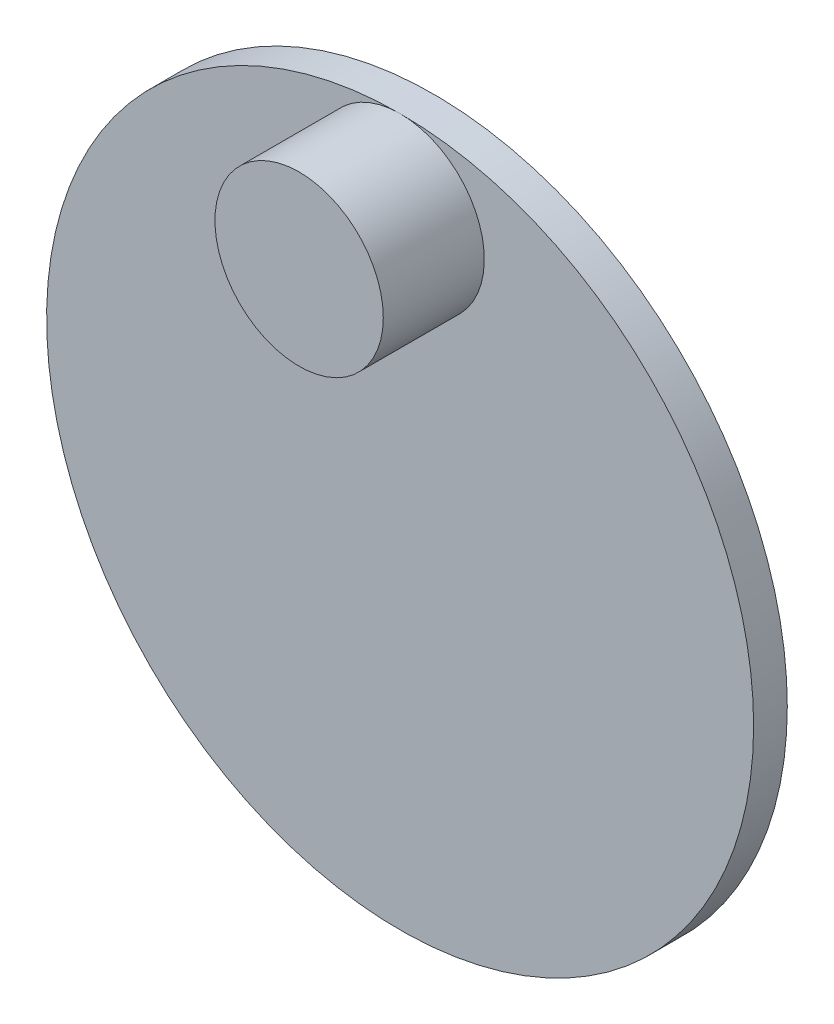
ISO-10303-21;
HEADER;
FILE_DESCRIPTION(('STEP AP214'),'2;1');
FILE_NAME('part.step','',(''),(''),'','','');
FILE_SCHEMA(('AUTOMOTIVE_DESIGN { 1 0 10303 214 1 1 1 1 }'));
ENDSEC;
DATA;
#1=APPLICATION_CONTEXT('core data for automotive mechanical design processes');
#2=APPLICATION_PROTOCOL_DEFINITION('international standard','automotive_design',2000,#1);
#3=PRODUCT_CONTEXT('',#1,'mechanical');
#4=PRODUCT('Part','Part','',(#3));
#5=PRODUCT_RELATED_PRODUCT_CATEGORY('part','',(#4));
#6=PRODUCT_DEFINITION_FORMATION('','',#4);
#7=PRODUCT_DEFINITION_CONTEXT('part definition',#1,'design');
#8=PRODUCT_DEFINITION('design','',#6,#7);
#9=PRODUCT_DEFINITION_SHAPE('','',#8);
#10=(LENGTH_UNIT() NAMED_UNIT(*) SI_UNIT(.MILLI.,.METRE.));
#11=(NAMED_UNIT(*) PLANE_ANGLE_UNIT() SI_UNIT($,.RADIAN.));
#12=(NAMED_UNIT(*) SI_UNIT($,.STERADIAN.) SOLID_ANGLE_UNIT());
#13=UNCERTAINTY_MEASURE_WITH_UNIT(LENGTH_MEASURE(1.E-05),#10,'distance_accuracy_value','');
#14=(GEOMETRIC_REPRESENTATION_CONTEXT(3) GLOBAL_UNCERTAINTY_ASSIGNED_CONTEXT((#13)) GLOBAL_UNIT_ASSIGNED_CONTEXT((#10,
#11,#12)) REPRESENTATION_CONTEXT('',''));
#15=CARTESIAN_POINT('',(0.,0.,0.));
#16=DIRECTION('',(0.,0.,1.));
#17=DIRECTION('',(1.,0.,0.));
#18=AXIS2_PLACEMENT_3D('',#15,#16,#17);
#19=CARTESIAN_POINT('',(0.,0.,10.));
#20=DIRECTION('',(0.,0.,1.));
#21=DIRECTION('',(1.,0.,0.));
#22=AXIS2_PLACEMENT_3D('',#19,#20,#21);
#23=PLANE('',#22);
#24=CARTESIAN_POINT('',(0.,80.,10.));
#25=DIRECTION('',(0.,0.,1.));
#26=DIRECTION('',(1.,0.,0.));
#27=AXIS2_PLACEMENT_3D('',#24,#25,#26);
#28=CIRCLE('',#27,25.);
#29=CARTESIAN_POINT('',(0.,105.,10.));
#30=VERTEX_POINT('',#29);
#31=EDGE_CURVE('E37',#30,#30,#28,.T.);
#32=ORIENTED_EDGE('',*,*,#31,.F.);
#33=CARTESIAN_POINT('',(0.,0.,10.));
#34=DIRECTION('',(0.,0.,1.));
#35=DIRECTION('',(1.,0.,0.));
#36=AXIS2_PLACEMENT_3D('',#33,#34,#35);
#37=CIRCLE('',#36,105.);
#38=EDGE_CURVE('E46',#30,#30,#37,.T.);
#39=ORIENTED_EDGE('',*,*,#38,.T.);
#40=EDGE_LOOP('',(#32,#39));
#41=FACE_BOUND('',#40,.T.);
#42=ADVANCED_FACE('F33',(#41),#23,.T.);
#43=CARTESIAN_POINT('',(0.,80.,40.));
#44=DIRECTION('',(0.,0.,-1.));
#45=DIRECTION('',(-1.,0.,0.));
#46=AXIS2_PLACEMENT_3D('',#43,#44,#45);
#47=CYLINDRICAL_SURFACE('',#46,25.);
#48=CARTESIAN_POINT('',(0.,80.,40.));
#49=DIRECTION('',(0.,0.,1.));
#50=DIRECTION('',(1.,0.,0.));
#51=AXIS2_PLACEMENT_3D('',#48,#49,#50);
#52=CIRCLE('',#51,25.);
#53=CARTESIAN_POINT('',(25.,80.,40.));
#54=VERTEX_POINT('',#53);
#55=EDGE_CURVE('E41',#54,#54,#52,.T.);
#56=ORIENTED_EDGE('',*,*,#55,.F.);
#57=EDGE_LOOP('',(#56));
#58=FACE_BOUND('',#57,.T.);
#59=ORIENTED_EDGE('',*,*,#31,.T.);
#60=EDGE_LOOP('',(#59));
#61=FACE_BOUND('',#60,.T.);
#62=ADVANCED_FACE('F62',(#58,#61),#47,.T.);
#63=CARTESIAN_POINT('',(0.,80.,40.));
#64=DIRECTION('',(0.,0.,1.));
#65=DIRECTION('',(1.,0.,0.));
#66=AXIS2_PLACEMENT_3D('',#63,#64,#65);
#67=PLANE('',#66);
#68=ORIENTED_EDGE('',*,*,#55,.T.);
#69=EDGE_LOOP('',(#68));
#70=FACE_BOUND('',#69,.T.);
#71=ADVANCED_FACE('F67',(#70),#67,.T.);
#72=CARTESIAN_POINT('',(0.,0.,0.));
#73=DIRECTION('',(0.,0.,1.));
#74=DIRECTION('',(1.,0.,0.));
#75=AXIS2_PLACEMENT_3D('',#72,#73,#74);
#76=CYLINDRICAL_SURFACE('',#75,105.);
#77=CARTESIAN_POINT('',(0.,0.,0.));
#78=DIRECTION('',(0.,0.,1.));
#79=DIRECTION('',(1.,0.,0.));
#80=AXIS2_PLACEMENT_3D('',#77,#78,#79);
#81=CIRCLE('',#80,105.);
#82=CARTESIAN_POINT('',(105.,0.,0.));
#83=VERTEX_POINT('',#82);
#84=EDGE_CURVE('E51',#83,#83,#81,.T.);
#85=ORIENTED_EDGE('',*,*,#84,.T.);
#86=EDGE_LOOP('',(#85));
#87=FACE_BOUND('',#86,.T.);
#88=ORIENTED_EDGE('',*,*,#38,.F.);
#89=EDGE_LOOP('',(#88));
#90=FACE_BOUND('',#89,.T.);
#91=ADVANCED_FACE('F47',(#87,#90),#76,.T.);
#92=CARTESIAN_POINT('',(0.,0.,-30.));
#93=DIRECTION('',(0.,0.,-1.));
#94=DIRECTION('',(-1.,0.,0.));
#95=AXIS2_PLACEMENT_3D('',#92,#93,#94);
#96=PLANE('',#95);
#97=CARTESIAN_POINT('',(0.,0.,-30.));
#98=DIRECTION('',(0.,0.,-1.));
#99=DIRECTION('',(-1.,0.,0.));
#100=AXIS2_PLACEMENT_3D('',#97,#98,#99);
#101=CIRCLE('',#100,30.);
#102=CARTESIAN_POINT('',(-30.,0.,-30.));
#103=VERTEX_POINT('',#102);
#104=EDGE_CURVE('E54',#103,#103,#101,.T.);
#105=ORIENTED_EDGE('',*,*,#104,.T.);
#106=EDGE_LOOP('',(#105));
#107=FACE_BOUND('',#106,.T.);
#108=ADVANCED_FACE('F76',(#107),#96,.T.);
#109=CARTESIAN_POINT('',(0.,0.,-30.));
#110=DIRECTION('',(0.,0.,1.));
#111=DIRECTION('',(1.,0.,0.));
#112=AXIS2_PLACEMENT_3D('',#109,#110,#111);
#113=CYLINDRICAL_SURFACE('',#112,30.);
#114=ORIENTED_EDGE('',*,*,#104,.F.);
#115=EDGE_LOOP('',(#114));
#116=FACE_BOUND('',#115,.T.);
#117=CARTESIAN_POINT('',(0.,0.,0.));
#118=DIRECTION('',(0.,0.,-1.));
#119=DIRECTION('',(-1.,0.,0.));
#120=AXIS2_PLACEMENT_3D('',#117,#118,#119);
#121=CIRCLE('',#120,30.);
#122=CARTESIAN_POINT('',(-30.,0.,0.));
#123=VERTEX_POINT('',#122);
#124=EDGE_CURVE('E11',#123,#123,#121,.T.);
#125=ORIENTED_EDGE('',*,*,#124,.T.);
#126=EDGE_LOOP('',(#125));
#127=FACE_BOUND('',#126,.T.);
#128=ADVANCED_FACE('F73',(#116,#127),#113,.T.);
#129=CARTESIAN_POINT('',(0.,0.,0.));
#130=DIRECTION('',(0.,0.,1.));
#131=DIRECTION('',(1.,0.,0.));
#132=AXIS2_PLACEMENT_3D('',#129,#130,#131);
#133=PLANE('',#132);
#134=ORIENTED_EDGE('',*,*,#124,.F.);
#135=EDGE_LOOP('',(#134));
#136=FACE_BOUND('',#135,.T.);
#137=ORIENTED_EDGE('',*,*,#84,.F.);
#138=EDGE_LOOP('',(#137));
#139=FACE_BOUND('',#138,.T.);
#140=ADVANCED_FACE('F35',(#136,#139),#133,.F.);
#141=CLOSED_SHELL('',(#42,#62,#71,#91,#108,#128,#140));
#142=MANIFOLD_SOLID_BREP('B2',#141);
#143=ADVANCED_BREP_SHAPE_REPRESENTATION('',(#18,#142),#14);
#144=SHAPE_DEFINITION_REPRESENTATION(#9,#143);
ENDSEC;
END-ISO-10303-21;
